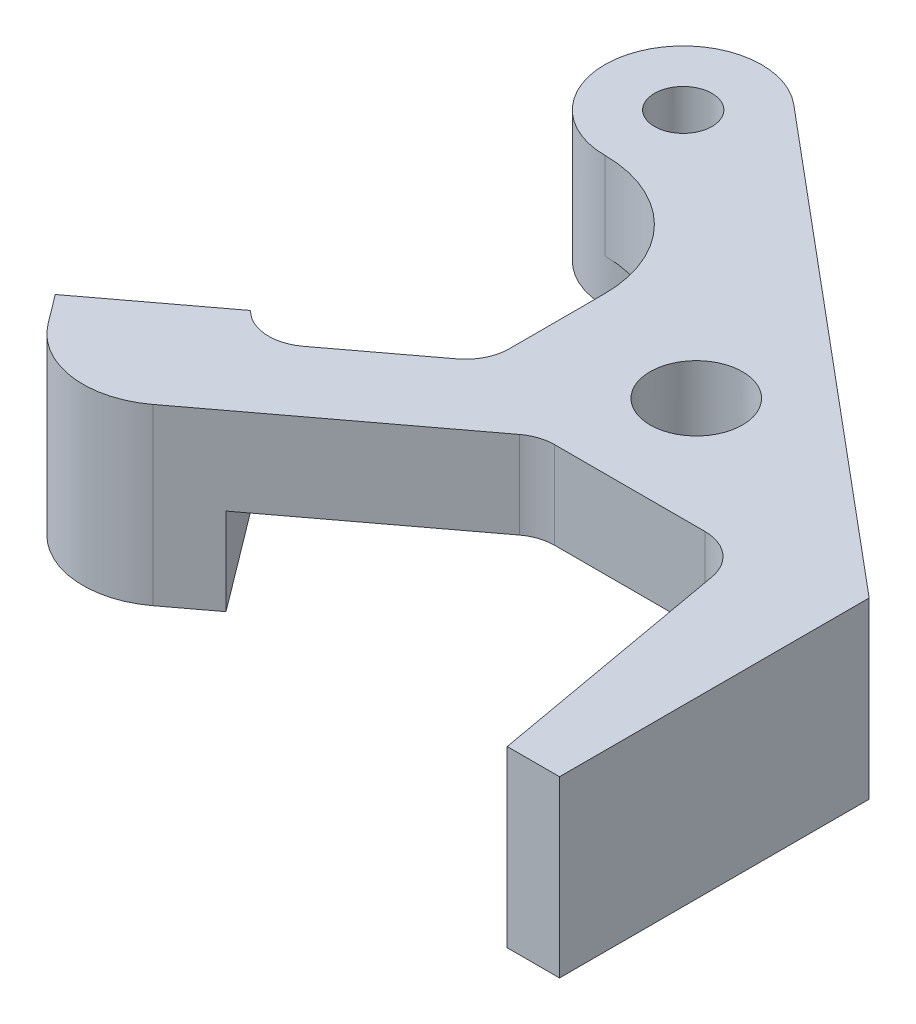
ISO-10303-21;
HEADER;
FILE_DESCRIPTION(('STEP AP214'),'2;1');
FILE_NAME('part.step','',(''),(''),'','','');
FILE_SCHEMA(('AUTOMOTIVE_DESIGN { 1 0 10303 214 1 1 1 1 }'));
ENDSEC;
DATA;
#1=APPLICATION_CONTEXT('core data for automotive mechanical design processes');
#2=APPLICATION_PROTOCOL_DEFINITION('international standard','automotive_design',2000,#1);
#3=PRODUCT_CONTEXT('',#1,'mechanical');
#4=PRODUCT('Part','Part','',(#3));
#5=PRODUCT_RELATED_PRODUCT_CATEGORY('part','',(#4));
#6=PRODUCT_DEFINITION_FORMATION('','',#4);
#7=PRODUCT_DEFINITION_CONTEXT('part definition',#1,'design');
#8=PRODUCT_DEFINITION('design','',#6,#7);
#9=PRODUCT_DEFINITION_SHAPE('','',#8);
#10=(LENGTH_UNIT() NAMED_UNIT(*) SI_UNIT(.MILLI.,.METRE.));
#11=(NAMED_UNIT(*) PLANE_ANGLE_UNIT() SI_UNIT($,.RADIAN.));
#12=(NAMED_UNIT(*) SI_UNIT($,.STERADIAN.) SOLID_ANGLE_UNIT());
#13=UNCERTAINTY_MEASURE_WITH_UNIT(LENGTH_MEASURE(1.E-05),#10,'distance_accuracy_value','');
#14=(GEOMETRIC_REPRESENTATION_CONTEXT(3) GLOBAL_UNCERTAINTY_ASSIGNED_CONTEXT((#13)) GLOBAL_UNIT_ASSIGNED_CONTEXT((#10,
#11,#12)) REPRESENTATION_CONTEXT('',''));
#15=CARTESIAN_POINT('',(0.,0.,0.));
#16=DIRECTION('',(0.,0.,1.));
#17=DIRECTION('',(1.,0.,0.));
#18=AXIS2_PLACEMENT_3D('',#15,#16,#17);
#19=CARTESIAN_POINT('',(29.5770247792777,15.,25.298132234084));
#20=DIRECTION('',(-1.,0.,0.));
#21=DIRECTION('',(0.,0.,1.));
#22=AXIS2_PLACEMENT_3D('',#19,#20,#21);
#23=PLANE('',#22);
#24=DIRECTION('',(0.,0.,1.));
#25=VECTOR('',#24,1.);
#26=CARTESIAN_POINT('',(29.5770247792777,5.,25.298132234084));
#27=LINE('',#26,#25);
#28=CARTESIAN_POINT('',(29.5770247792776,5.,7.53597274184177));
#29=VERTEX_POINT('',#28);
#30=CARTESIAN_POINT('',(29.5770247792777,5.,25.298132234084));
#31=VERTEX_POINT('',#30);
#32=EDGE_CURVE('E47',#29,#31,#27,.T.);
#33=ORIENTED_EDGE('',*,*,#32,.F.);
#34=DIRECTION('',(0.,-1.,0.));
#35=VECTOR('',#34,1.);
#36=CARTESIAN_POINT('',(29.5770247792776,15.,7.53597274184177));
#37=LINE('',#36,#35);
#38=CARTESIAN_POINT('',(29.5770247792776,15.,7.53597274184177));
#39=VERTEX_POINT('',#38);
#40=EDGE_CURVE('E40',#39,#29,#37,.T.);
#41=ORIENTED_EDGE('',*,*,#40,.F.);
#42=DIRECTION('',(0.,0.,-1.));
#43=VECTOR('',#42,1.);
#44=CARTESIAN_POINT('',(29.5770247792777,15.,25.298132234084));
#45=LINE('',#44,#43);
#46=CARTESIAN_POINT('',(29.5770247792777,15.,25.298132234084));
#47=VERTEX_POINT('',#46);
#48=EDGE_CURVE('E203',#47,#39,#45,.T.);
#49=ORIENTED_EDGE('',*,*,#48,.F.);
#50=DIRECTION('',(0.,-1.,0.));
#51=VECTOR('',#50,1.);
#52=CARTESIAN_POINT('',(29.5770247792777,15.,25.298132234084));
#53=LINE('',#52,#51);
#54=EDGE_CURVE('E238',#47,#31,#53,.T.);
#55=ORIENTED_EDGE('',*,*,#54,.T.);
#56=EDGE_LOOP('',(#33,#41,#49,#55));
#57=FACE_BOUND('',#56,.T.);
#58=ADVANCED_FACE('F33',(#57),#23,.F.);
#59=CARTESIAN_POINT('',(29.5770247792776,15.,7.53597274184177));
#60=DIRECTION('',(-0.642235166658426,0.,0.766507658609634));
#61=DIRECTION('',(0.766507658609634,0.,0.642235166658426));
#62=AXIS2_PLACEMENT_3D('',#59,#60,#61);
#63=PLANE('',#62);
#64=DIRECTION('',(0.766507658609634,0.,0.642235166658426));
#65=VECTOR('',#64,1.);
#66=CARTESIAN_POINT('',(29.5770247792776,5.,7.53597274184177));
#67=LINE('',#66,#65);
#68=CARTESIAN_POINT('',(22.3186698476297,5.,1.45440168794189));
#69=VERTEX_POINT('',#68);
#70=EDGE_CURVE('E297',#69,#29,#67,.T.);
#71=ORIENTED_EDGE('',*,*,#70,.F.);
#72=DIRECTION('',(0.,-1.,0.));
#73=VECTOR('',#72,1.);
#74=CARTESIAN_POINT('',(22.3186698476297,10.,1.45440168794189));
#75=LINE('',#74,#73);
#76=CARTESIAN_POINT('',(22.3186698476297,10.,1.45440168794189));
#77=VERTEX_POINT('',#76);
#78=EDGE_CURVE('E289',#77,#69,#75,.T.);
#79=ORIENTED_EDGE('',*,*,#78,.F.);
#80=DIRECTION('',(0.766507658609634,0.,0.642235166658426));
#81=VECTOR('',#80,1.);
#82=CARTESIAN_POINT('',(22.3186698476297,10.,1.45440168794189));
#83=LINE('',#82,#81);
#84=CARTESIAN_POINT('',(2.89005824996292,10.,-14.8242844637434));
#85=VERTEX_POINT('',#84);
#86=EDGE_CURVE('E306',#85,#77,#83,.T.);
#87=ORIENTED_EDGE('',*,*,#86,.F.);
#88=DIRECTION('',(0.,-1.,0.));
#89=VECTOR('',#88,1.);
#90=CARTESIAN_POINT('',(2.89005824996292,15.,-14.8242844637434));
#91=LINE('',#90,#89);
#92=CARTESIAN_POINT('',(2.89005824996292,15.,-14.8242844637434));
#93=VERTEX_POINT('',#92);
#94=EDGE_CURVE('E281',#93,#85,#91,.T.);
#95=ORIENTED_EDGE('',*,*,#94,.F.);
#96=DIRECTION('',(-0.766507658609634,0.,-0.642235166658426));
#97=VECTOR('',#96,1.);
#98=CARTESIAN_POINT('',(29.5770247792776,15.,7.53597274184177));
#99=LINE('',#98,#97);
#100=EDGE_CURVE('E206',#39,#93,#99,.T.);
#101=ORIENTED_EDGE('',*,*,#100,.F.);
#102=ORIENTED_EDGE('',*,*,#40,.T.);
#103=EDGE_LOOP('',(#71,#79,#87,#95,#101,#102));
#104=FACE_BOUND('',#103,.T.);
#105=ADVANCED_FACE('F354',(#104),#63,.F.);
#106=CARTESIAN_POINT('',(-2.44771868641612,15.,10.9979278536704));
#107=DIRECTION('',(0.600835617642508,0.,0.799372604341771));
#108=DIRECTION('',(0.799372604341771,0.,-0.600835617642508));
#109=AXIS2_PLACEMENT_3D('',#106,#107,#108);
#110=PLANE('',#109);
#111=CARTESIAN_POINT('',(-5.6452091037832,10.,13.4012703242404));
#112=DIRECTION('',(-0.600835617642508,0.,-0.799372604341771));
#113=DIRECTION('',(-0.799372604341771,0.,0.600835617642508));
#114=AXIS2_PLACEMENT_3D('',#111,#112,#113);
#115=CIRCLE('',#114,2.75);
#116=CARTESIAN_POINT('',(-7.84348376572307,10.,15.0535682727573));
#117=VERTEX_POINT('',#116);
#118=EDGE_CURVE('E420',#117,#117,#115,.T.);
#119=ORIENTED_EDGE('',*,*,#118,.F.);
#120=EDGE_LOOP('',(#119));
#121=FACE_BOUND('',#120,.T.);
#122=DIRECTION('',(0.799372604341771,0.,-0.600835617642508));
#123=VECTOR('',#122,1.);
#124=CARTESIAN_POINT('',(-2.44771868641612,5.,10.9979278536704));
#125=LINE('',#124,#123);
#126=CARTESIAN_POINT('',(-8.84269952115029,5.,15.8046127948105));
#127=VERTEX_POINT('',#126);
#128=CARTESIAN_POINT('',(-2.44771868641612,5.,10.9979278536704));
#129=VERTEX_POINT('',#128);
#130=EDGE_CURVE('E54',#127,#129,#125,.T.);
#131=ORIENTED_EDGE('',*,*,#130,.F.);
#132=DIRECTION('',(0.,-1.,0.));
#133=VECTOR('',#132,1.);
#134=CARTESIAN_POINT('',(-8.84269952115029,15.,15.8046127948105));
#135=LINE('',#134,#133);
#136=CARTESIAN_POINT('',(-8.84269952115029,15.,15.8046127948105));
#137=VERTEX_POINT('',#136);
#138=EDGE_CURVE('E260',#137,#127,#135,.T.);
#139=ORIENTED_EDGE('',*,*,#138,.F.);
#140=DIRECTION('',(-0.799372604341771,0.,0.600835617642508));
#141=VECTOR('',#140,1.);
#142=CARTESIAN_POINT('',(-2.44771868641612,15.,10.9979278536704));
#143=LINE('',#142,#141);
#144=CARTESIAN_POINT('',(-2.44771868641611,15.,10.9979278536704));
#145=VERTEX_POINT('',#144);
#146=EDGE_CURVE('E220',#145,#137,#143,.T.);
#147=ORIENTED_EDGE('',*,*,#146,.F.);
#148=DIRECTION('',(0.,-1.,0.));
#149=VECTOR('',#148,1.);
#150=CARTESIAN_POINT('',(-2.44771868641611,15.,10.9979278536704));
#151=LINE('',#150,#149);
#152=CARTESIAN_POINT('',(-2.44771868641612,10.,10.9979278536704));
#153=VERTEX_POINT('',#152);
#154=EDGE_CURVE('E263',#145,#153,#151,.T.);
#155=ORIENTED_EDGE('',*,*,#154,.T.);
#156=DIRECTION('',(0.,-1.,0.));
#157=VECTOR('',#156,1.);
#158=CARTESIAN_POINT('',(-2.44771868641612,10.,10.9979278536704));
#159=LINE('',#158,#157);
#160=EDGE_CURVE('E310',#153,#129,#159,.T.);
#161=ORIENTED_EDGE('',*,*,#160,.T.);
#162=EDGE_LOOP('',(#131,#139,#147,#155,#161));
#163=FACE_BOUND('',#162,.T.);
#164=ADVANCED_FACE('F385',(#121,#163),#110,.F.);
#165=CARTESIAN_POINT('',(-8.84269952115029,15.,15.8046127948105));
#166=DIRECTION('',(0.799372604341771,0.,-0.600835617642508));
#167=DIRECTION('',(-0.600835617642508,0.,-0.799372604341771));
#168=AXIS2_PLACEMENT_3D('',#165,#166,#167);
#169=PLANE('',#168);
#170=DIRECTION('',(-0.600835617642508,0.,-0.799372604341771));
#171=VECTOR('',#170,1.);
#172=CARTESIAN_POINT('',(-8.84269952115029,5.,15.8046127948105));
#173=LINE('',#172,#171);
#174=CARTESIAN_POINT('',(-7.58603056717289,5.,17.4765288814065));
#175=VERTEX_POINT('',#174);
#176=EDGE_CURVE('E415',#175,#127,#173,.T.);
#177=ORIENTED_EDGE('',*,*,#176,.F.);
#178=DIRECTION('',(0.,-1.,0.));
#179=VECTOR('',#178,1.);
#180=CARTESIAN_POINT('',(-7.58603056717289,15.,17.4765288814065));
#181=LINE('',#180,#179);
#182=CARTESIAN_POINT('',(-7.58603056717289,15.,17.4765288814065));
#183=VERTEX_POINT('',#182);
#184=EDGE_CURVE('E257',#183,#175,#181,.T.);
#185=ORIENTED_EDGE('',*,*,#184,.F.);
#186=DIRECTION('',(0.600835617642508,0.,0.799372604341771));
#187=VECTOR('',#186,1.);
#188=CARTESIAN_POINT('',(-8.84269952115029,15.,15.8046127948105));
#189=LINE('',#188,#187);
#190=EDGE_CURVE('E222',#137,#183,#189,.T.);
#191=ORIENTED_EDGE('',*,*,#190,.F.);
#192=ORIENTED_EDGE('',*,*,#138,.T.);
#193=EDGE_LOOP('',(#177,#185,#191,#192));
#194=FACE_BOUND('',#193,.T.);
#195=ADVANCED_FACE('F436',(#194),#169,.F.);
#196=CARTESIAN_POINT('',(-3.58916754546404,15.,14.472350793194));
#197=DIRECTION('',(0.,-1.,0.));
#198=DIRECTION('',(0.,0.,-1.));
#199=AXIS2_PLACEMENT_3D('',#196,#197,#198);
#200=CYLINDRICAL_SURFACE('',#199,5.);
#201=CARTESIAN_POINT('',(-3.58916754546404,5.,14.472350793194));
#202=DIRECTION('',(0.,-1.,0.));
#203=DIRECTION('',(0.,0.,-1.));
#204=AXIS2_PLACEMENT_3D('',#201,#202,#203);
#205=CIRCLE('',#204,5.);
#206=CARTESIAN_POINT('',(-0.584989457251495,5.,18.4692138149028));
#207=VERTEX_POINT('',#206);
#208=EDGE_CURVE('E179',#207,#175,#205,.T.);
#209=ORIENTED_EDGE('',*,*,#208,.F.);
#210=DIRECTION('',(0.,-1.,0.));
#211=VECTOR('',#210,1.);
#212=CARTESIAN_POINT('',(-0.584989457251495,15.,18.4692138149028));
#213=LINE('',#212,#211);
#214=CARTESIAN_POINT('',(-0.584989457251495,15.,18.4692138149028));
#215=VERTEX_POINT('',#214);
#216=EDGE_CURVE('E178',#215,#207,#213,.T.);
#217=ORIENTED_EDGE('',*,*,#216,.F.);
#218=CARTESIAN_POINT('',(-3.58916754546404,15.,14.472350793194));
#219=DIRECTION('',(0.,1.,0.));
#220=DIRECTION('',(0.,0.,1.));
#221=AXIS2_PLACEMENT_3D('',#218,#219,#220);
#222=CIRCLE('',#221,5.);
#223=EDGE_CURVE('E224',#183,#215,#222,.T.);
#224=ORIENTED_EDGE('',*,*,#223,.F.);
#225=ORIENTED_EDGE('',*,*,#184,.T.);
#226=EDGE_LOOP('',(#209,#217,#224,#225));
#227=FACE_BOUND('',#226,.T.);
#228=ADVANCED_FACE('F441',(#227),#200,.T.);
#229=CARTESIAN_POINT('',(-0.584989457251495,15.,18.4692138149028));
#230=DIRECTION('',(-0.600835617642508,0.,-0.799372604341771));
#231=DIRECTION('',(-0.799372604341771,0.,0.600835617642508));
#232=AXIS2_PLACEMENT_3D('',#229,#230,#231);
#233=PLANE('',#232);
#234=DIRECTION('',(-0.799372604341771,0.,0.600835617642508));
#235=VECTOR('',#234,1.);
#236=CARTESIAN_POINT('',(-0.584989457251495,5.,18.4692138149028));
#237=LINE('',#236,#235);
#238=CARTESIAN_POINT('',(1.81312835577382,5.,16.6667069619753));
#239=VERTEX_POINT('',#238);
#240=EDGE_CURVE('E164',#239,#207,#237,.T.);
#241=ORIENTED_EDGE('',*,*,#240,.F.);
#242=DIRECTION('',(0.,1.,0.));
#243=VECTOR('',#242,1.);
#244=CARTESIAN_POINT('',(1.81312835577382,15.,16.6667069619753));
#245=LINE('',#244,#243);
#246=CARTESIAN_POINT('',(1.81312835577382,10.,16.6667069619753));
#247=VERTEX_POINT('',#246);
#248=EDGE_CURVE('E174',#239,#247,#245,.T.);
#249=ORIENTED_EDGE('',*,*,#248,.T.);
#250=DIRECTION('',(-0.799372604341771,0.,0.600835617642508));
#251=VECTOR('',#250,1.);
#252=CARTESIAN_POINT('',(-0.584989457251495,10.,18.4692138149028));
#253=LINE('',#252,#251);
#254=CARTESIAN_POINT('',(11.4228518339597,10.,9.44371219078979));
#255=VERTEX_POINT('',#254);
#256=EDGE_CURVE('E319',#255,#247,#253,.T.);
#257=ORIENTED_EDGE('',*,*,#256,.F.);
#258=DIRECTION('',(0.,-1.,0.));
#259=VECTOR('',#258,1.);
#260=CARTESIAN_POINT('',(11.4228518339597,15.,9.44371219078979));
#261=LINE('',#260,#259);
#262=CARTESIAN_POINT('',(11.4228518339597,15.,9.44371219078979));
#263=VERTEX_POINT('',#262);
#264=EDGE_CURVE('E253',#263,#255,#261,.T.);
#265=ORIENTED_EDGE('',*,*,#264,.F.);
#266=DIRECTION('',(0.799372604341771,0.,-0.600835617642508));
#267=VECTOR('',#266,1.);
#268=CARTESIAN_POINT('',(-0.584989457251495,15.,18.4692138149028));
#269=LINE('',#268,#267);
#270=EDGE_CURVE('E226',#215,#263,#269,.T.);
#271=ORIENTED_EDGE('',*,*,#270,.F.);
#272=ORIENTED_EDGE('',*,*,#216,.T.);
#273=EDGE_LOOP('',(#241,#249,#257,#265,#271,#272));
#274=FACE_BOUND('',#273,.T.);
#275=ADVANCED_FACE('F172',(#274),#233,.F.);
#276=CARTESIAN_POINT('',(24.0239261003502,15.,11.0026125004812));
#277=DIRECTION('',(0.984423674904598,0.,-0.175812480465197));
#278=DIRECTION('',(-0.175812480465197,0.,-0.984423674904599));
#279=AXIS2_PLACEMENT_3D('',#276,#277,#278);
#280=PLANE('',#279);
#281=DIRECTION('',(-0.175812480465197,0.,-0.984423674904599));
#282=VECTOR('',#281,1.);
#283=CARTESIAN_POINT('',(24.0239261003502,5.,11.0026125004812));
#284=LINE('',#283,#282);
#285=CARTESIAN_POINT('',(26.5770247792777,5.,25.298132234084));
#286=VERTEX_POINT('',#285);
#287=EDGE_CURVE('E299',#286,#69,#284,.T.);
#288=ORIENTED_EDGE('',*,*,#287,.F.);
#289=DIRECTION('',(0.,-1.,0.));
#290=VECTOR('',#289,1.);
#291=CARTESIAN_POINT('',(26.5770247792777,15.,25.298132234084));
#292=LINE('',#291,#290);
#293=CARTESIAN_POINT('',(26.5770247792777,15.,25.298132234084));
#294=VERTEX_POINT('',#293);
#295=EDGE_CURVE('E241',#294,#286,#292,.T.);
#296=ORIENTED_EDGE('',*,*,#295,.F.);
#297=DIRECTION('',(0.175812480465197,0.,0.984423674904599));
#298=VECTOR('',#297,1.);
#299=CARTESIAN_POINT('',(24.0239261003502,15.,11.0026125004812));
#300=LINE('',#299,#298);
#301=CARTESIAN_POINT('',(24.0239261003502,15.,11.0026125004812));
#302=VERTEX_POINT('',#301);
#303=EDGE_CURVE('E234',#302,#294,#300,.T.);
#304=ORIENTED_EDGE('',*,*,#303,.F.);
#305=DIRECTION('',(0.,-1.,0.));
#306=VECTOR('',#305,1.);
#307=CARTESIAN_POINT('',(24.0239261003502,15.,11.0026125004812));
#308=LINE('',#307,#306);
#309=CARTESIAN_POINT('',(24.0239261003502,10.,11.0026125004812));
#310=VERTEX_POINT('',#309);
#311=EDGE_CURVE('E244',#302,#310,#308,.T.);
#312=ORIENTED_EDGE('',*,*,#311,.T.);
#313=DIRECTION('',(0.175812480465197,0.,0.984423674904599));
#314=VECTOR('',#313,1.);
#315=CARTESIAN_POINT('',(24.0239261003502,10.,11.0026125004812));
#316=LINE('',#315,#314);
#317=EDGE_CURVE('E308',#77,#310,#316,.T.);
#318=ORIENTED_EDGE('',*,*,#317,.F.);
#319=ORIENTED_EDGE('',*,*,#78,.T.);
#320=EDGE_LOOP('',(#288,#296,#304,#312,#318,#319));
#321=FACE_BOUND('',#320,.T.);
#322=ADVANCED_FACE('F357',(#321),#280,.F.);
#323=CARTESIAN_POINT('',(26.5770247792777,15.,25.298132234084));
#324=DIRECTION('',(0.,0.,-1.));
#325=DIRECTION('',(-1.,0.,0.));
#326=AXIS2_PLACEMENT_3D('',#323,#324,#325);
#327=PLANE('',#326);
#328=DIRECTION('',(-1.,0.,0.));
#329=VECTOR('',#328,1.);
#330=CARTESIAN_POINT('',(26.5770247792777,5.,25.298132234084));
#331=LINE('',#330,#329);
#332=EDGE_CURVE('E413',#31,#286,#331,.T.);
#333=ORIENTED_EDGE('',*,*,#332,.F.);
#334=ORIENTED_EDGE('',*,*,#54,.F.);
#335=DIRECTION('',(1.,0.,0.));
#336=VECTOR('',#335,1.);
#337=CARTESIAN_POINT('',(26.5770247792777,15.,25.298132234084));
#338=LINE('',#337,#336);
#339=EDGE_CURVE('E236',#294,#47,#338,.T.);
#340=ORIENTED_EDGE('',*,*,#339,.F.);
#341=ORIENTED_EDGE('',*,*,#295,.T.);
#342=EDGE_LOOP('',(#333,#334,#340,#341));
#343=FACE_BOUND('',#342,.T.);
#344=ADVANCED_FACE('F412',(#343),#327,.F.);
#345=CARTESIAN_POINT('',(-2.44771868641612,10.,10.9979278536704));
#346=DIRECTION('',(-0.799372604341771,0.,0.600835617642508));
#347=DIRECTION('',(0.600835617642508,0.,0.799372604341771));
#348=AXIS2_PLACEMENT_3D('',#345,#346,#347);
#349=PLANE('',#348);
#350=DIRECTION('',(0.600835617642508,0.,0.799372604341771));
#351=VECTOR('',#350,1.);
#352=CARTESIAN_POINT('',(-2.44771868641612,5.,10.9979278536704));
#353=LINE('',#352,#351);
#354=EDGE_CURVE('E11',#129,#239,#353,.T.);
#355=ORIENTED_EDGE('',*,*,#354,.F.);
#356=ORIENTED_EDGE('',*,*,#160,.F.);
#357=DIRECTION('',(-0.600835617642508,0.,-0.799372604341771));
#358=VECTOR('',#357,1.);
#359=CARTESIAN_POINT('',(-2.44771868641612,10.,10.9979278536704));
#360=LINE('',#359,#358);
#361=EDGE_CURVE('E184',#247,#153,#360,.T.);
#362=ORIENTED_EDGE('',*,*,#361,.F.);
#363=ORIENTED_EDGE('',*,*,#248,.F.);
#364=EDGE_LOOP('',(#355,#356,#362,#363));
#365=FACE_BOUND('',#364,.T.);
#366=ADVANCED_FACE('F183',(#365),#349,.F.);
#367=CARTESIAN_POINT('',(0.,15.,-11.375));
#368=DIRECTION('',(0.,1.,0.));
#369=DIRECTION('',(0.,0.,1.));
#370=AXIS2_PLACEMENT_3D('',#367,#368,#369);
#371=CYLINDRICAL_SURFACE('',#370,1.65);
#372=CARTESIAN_POINT('',(0.,15.,-11.375));
#373=DIRECTION('',(0.,1.,0.));
#374=DIRECTION('',(0.,0.,1.));
#375=AXIS2_PLACEMENT_3D('',#372,#373,#374);
#376=CIRCLE('',#375,1.65);
#377=CARTESIAN_POINT('',(0.,15.,-9.725));
#378=VERTEX_POINT('',#377);
#379=EDGE_CURVE('E197',#378,#378,#376,.T.);
#380=ORIENTED_EDGE('',*,*,#379,.T.);
#381=EDGE_LOOP('',(#380));
#382=FACE_BOUND('',#381,.T.);
#383=CARTESIAN_POINT('',(0.,2.5,-11.375));
#384=DIRECTION('',(0.,-1.,0.));
#385=DIRECTION('',(0.,0.,-1.));
#386=AXIS2_PLACEMENT_3D('',#383,#384,#385);
#387=CIRCLE('',#386,1.65);
#388=CARTESIAN_POINT('',(0.,2.5,-13.025));
#389=VERTEX_POINT('',#388);
#390=EDGE_CURVE('E292',#389,#389,#387,.F.);
#391=ORIENTED_EDGE('',*,*,#390,.F.);
#392=EDGE_LOOP('',(#391));
#393=FACE_BOUND('',#392,.T.);
#394=ADVANCED_FACE('F488',(#382,#393),#371,.F.);
#395=CARTESIAN_POINT('',(0.,7.5,-11.375));
#396=DIRECTION('',(0.,-1.,0.));
#397=DIRECTION('',(0.,0.,-1.));
#398=AXIS2_PLACEMENT_3D('',#395,#396,#397);
#399=CYLINDRICAL_SURFACE('',#398,3.15);
#400=CARTESIAN_POINT('',(0.,7.5,-11.375));
#401=DIRECTION('',(0.,-1.,0.));
#402=DIRECTION('',(0.,0.,-1.));
#403=AXIS2_PLACEMENT_3D('',#400,#401,#402);
#404=CIRCLE('',#403,3.15);
#405=CARTESIAN_POINT('',(0.,7.5,-14.525));
#406=VERTEX_POINT('',#405);
#407=EDGE_CURVE('E185',#406,#406,#404,.T.);
#408=ORIENTED_EDGE('',*,*,#407,.T.);
#409=EDGE_LOOP('',(#408));
#410=FACE_BOUND('',#409,.T.);
#411=CARTESIAN_POINT('',(0.,2.5,-11.375));
#412=DIRECTION('',(0.,-1.,0.));
#413=DIRECTION('',(0.,0.,-1.));
#414=AXIS2_PLACEMENT_3D('',#411,#412,#413);
#415=CIRCLE('',#414,3.15);
#416=CARTESIAN_POINT('',(0.,2.5,-14.525));
#417=VERTEX_POINT('',#416);
#418=EDGE_CURVE('E290',#417,#417,#415,.F.);
#419=ORIENTED_EDGE('',*,*,#418,.T.);
#420=EDGE_LOOP('',(#419));
#421=FACE_BOUND('',#420,.T.);
#422=ADVANCED_FACE('F496',(#410,#421),#399,.T.);
#423=CARTESIAN_POINT('',(0.,15.,0.));
#424=DIRECTION('',(0.,-1.,0.));
#425=DIRECTION('',(0.,0.,-1.));
#426=AXIS2_PLACEMENT_3D('',#423,#424,#425);
#427=CYLINDRICAL_SURFACE('',#426,6.875);
#428=CARTESIAN_POINT('',(0.,10.,0.));
#429=DIRECTION('',(0.,-1.,0.));
#430=DIRECTION('',(0.,0.,-1.));
#431=AXIS2_PLACEMENT_3D('',#428,#429,#430);
#432=CIRCLE('',#431,6.875);
#433=CARTESIAN_POINT('',(6.875,10.,0.));
#434=VERTEX_POINT('',#433);
#435=CARTESIAN_POINT('',(0.,10.,-6.875));
#436=VERTEX_POINT('',#435);
#437=EDGE_CURVE('E186',#434,#436,#432,.F.);
#438=ORIENTED_EDGE('',*,*,#437,.F.);
#439=DIRECTION('',(0.,-1.,0.));
#440=VECTOR('',#439,1.);
#441=CARTESIAN_POINT('',(6.875,15.,0.));
#442=LINE('',#441,#440);
#443=CARTESIAN_POINT('',(6.875,15.,0.));
#444=VERTEX_POINT('',#443);
#445=EDGE_CURVE('E275',#444,#434,#442,.T.);
#446=ORIENTED_EDGE('',*,*,#445,.F.);
#447=CARTESIAN_POINT('',(0.,15.,0.));
#448=DIRECTION('',(0.,-1.,0.));
#449=DIRECTION('',(0.,0.,-1.));
#450=AXIS2_PLACEMENT_3D('',#447,#448,#449);
#451=CIRCLE('',#450,6.875);
#452=CARTESIAN_POINT('',(0.,15.,-6.875));
#453=VERTEX_POINT('',#452);
#454=EDGE_CURVE('E210',#453,#444,#451,.T.);
#455=ORIENTED_EDGE('',*,*,#454,.F.);
#456=DIRECTION('',(0.,-1.,0.));
#457=VECTOR('',#456,1.);
#458=CARTESIAN_POINT('',(0.,15.,-6.875));
#459=LINE('',#458,#457);
#460=EDGE_CURVE('E278',#453,#436,#459,.T.);
#461=ORIENTED_EDGE('',*,*,#460,.T.);
#462=EDGE_LOOP('',(#438,#446,#455,#461));
#463=FACE_BOUND('',#462,.T.);
#464=ADVANCED_FACE('F336',(#463),#427,.F.);
#465=CARTESIAN_POINT('',(6.875,15.,0.));
#466=DIRECTION('',(1.,0.,0.));
#467=DIRECTION('',(0.,0.,-1.));
#468=AXIS2_PLACEMENT_3D('',#465,#466,#467);
#469=PLANE('',#468);
#470=DIRECTION('',(0.,0.,-1.));
#471=VECTOR('',#470,1.);
#472=CARTESIAN_POINT('',(6.875,10.,0.));
#473=LINE('',#472,#471);
#474=CARTESIAN_POINT('',(6.875,10.,5.48279869002336));
#475=VERTEX_POINT('',#474);
#476=EDGE_CURVE('E191',#475,#434,#473,.T.);
#477=ORIENTED_EDGE('',*,*,#476,.F.);
#478=DIRECTION('',(0.,-1.,0.));
#479=VECTOR('',#478,1.);
#480=CARTESIAN_POINT('',(6.875,15.,5.48279869002336));
#481=LINE('',#480,#479);
#482=CARTESIAN_POINT('',(6.875,15.,5.48279869002336));
#483=VERTEX_POINT('',#482);
#484=EDGE_CURVE('E272',#483,#475,#481,.T.);
#485=ORIENTED_EDGE('',*,*,#484,.F.);
#486=DIRECTION('',(0.,0.,1.));
#487=VECTOR('',#486,1.);
#488=CARTESIAN_POINT('',(6.875,15.,0.));
#489=LINE('',#488,#487);
#490=EDGE_CURVE('E212',#444,#483,#489,.T.);
#491=ORIENTED_EDGE('',*,*,#490,.F.);
#492=ORIENTED_EDGE('',*,*,#445,.T.);
#493=EDGE_LOOP('',(#477,#485,#491,#492));
#494=FACE_BOUND('',#493,.T.);
#495=ADVANCED_FACE('F340',(#494),#469,.F.);
#496=CARTESIAN_POINT('',(4.375,15.,5.48279869002336));
#497=DIRECTION('',(0.,-1.,0.));
#498=DIRECTION('',(0.,0.,-1.));
#499=AXIS2_PLACEMENT_3D('',#496,#497,#498);
#500=CYLINDRICAL_SURFACE('',#499,2.5);
#501=CARTESIAN_POINT('',(4.375,10.,5.48279869002336));
#502=DIRECTION('',(0.,-1.,0.));
#503=DIRECTION('',(0.,0.,-1.));
#504=AXIS2_PLACEMENT_3D('',#501,#502,#503);
#505=CIRCLE('',#504,2.5);
#506=CARTESIAN_POINT('',(5.87708904410627,10.,7.48123020087779));
#507=VERTEX_POINT('',#506);
#508=EDGE_CURVE('E325',#507,#475,#505,.F.);
#509=ORIENTED_EDGE('',*,*,#508,.F.);
#510=DIRECTION('',(0.,-1.,0.));
#511=VECTOR('',#510,1.);
#512=CARTESIAN_POINT('',(5.87708904410627,15.,7.48123020087779));
#513=LINE('',#512,#511);
#514=CARTESIAN_POINT('',(5.87708904410627,15.,7.48123020087779));
#515=VERTEX_POINT('',#514);
#516=EDGE_CURVE('E269',#515,#507,#513,.T.);
#517=ORIENTED_EDGE('',*,*,#516,.F.);
#518=CARTESIAN_POINT('',(4.375,15.,5.48279869002336));
#519=DIRECTION('',(0.,-1.,0.));
#520=DIRECTION('',(0.,0.,-1.));
#521=AXIS2_PLACEMENT_3D('',#518,#519,#520);
#522=CIRCLE('',#521,2.5);
#523=EDGE_CURVE('E214',#483,#515,#522,.T.);
#524=ORIENTED_EDGE('',*,*,#523,.F.);
#525=ORIENTED_EDGE('',*,*,#484,.T.);
#526=EDGE_LOOP('',(#509,#517,#524,#525));
#527=FACE_BOUND('',#526,.T.);
#528=ADVANCED_FACE('F393',(#527),#500,.F.);
#529=CARTESIAN_POINT('',(5.87708904410627,15.,7.48123020087779));
#530=DIRECTION('',(0.600835617642508,0.,0.799372604341771));
#531=DIRECTION('',(0.799372604341771,0.,-0.600835617642508));
#532=AXIS2_PLACEMENT_3D('',#529,#530,#531);
#533=PLANE('',#532);
#534=DIRECTION('',(0.799372604341771,0.,-0.600835617642508));
#535=VECTOR('',#534,1.);
#536=CARTESIAN_POINT('',(5.87708904410627,10.,7.48123020087779));
#537=LINE('',#536,#535);
#538=CARTESIAN_POINT('',(0.851602255927196,10.,11.2585568717313));
#539=VERTEX_POINT('',#538);
#540=EDGE_CURVE('E323',#539,#507,#537,.T.);
#541=ORIENTED_EDGE('',*,*,#540,.F.);
#542=DIRECTION('',(0.,-1.,0.));
#543=VECTOR('',#542,1.);
#544=CARTESIAN_POINT('',(0.851602255927196,15.,11.2585568717313));
#545=LINE('',#544,#543);
#546=CARTESIAN_POINT('',(0.851602255927196,15.,11.2585568717313));
#547=VERTEX_POINT('',#546);
#548=EDGE_CURVE('E266',#547,#539,#545,.T.);
#549=ORIENTED_EDGE('',*,*,#548,.F.);
#550=DIRECTION('',(-0.799372604341771,0.,0.600835617642508));
#551=VECTOR('',#550,1.);
#552=CARTESIAN_POINT('',(5.87708904410627,15.,7.48123020087779));
#553=LINE('',#552,#551);
#554=EDGE_CURVE('E216',#515,#547,#553,.T.);
#555=ORIENTED_EDGE('',*,*,#554,.F.);
#556=ORIENTED_EDGE('',*,*,#516,.T.);
#557=EDGE_LOOP('',(#541,#549,#555,#556));
#558=FACE_BOUND('',#557,.T.);
#559=ADVANCED_FACE('F391',(#558),#533,.F.);
#560=CARTESIAN_POINT('',(-0.650486788179074,15.,9.26012536087692));
#561=DIRECTION('',(0.,-1.,0.));
#562=DIRECTION('',(0.,0.,-1.));
#563=AXIS2_PLACEMENT_3D('',#560,#561,#562);
#564=CYLINDRICAL_SURFACE('',#563,2.5);
#565=CARTESIAN_POINT('',(-0.650486788179074,10.,9.26012536087692));
#566=DIRECTION('',(0.,-1.,0.));
#567=DIRECTION('',(0.,0.,-1.));
#568=AXIS2_PLACEMENT_3D('',#565,#566,#567);
#569=CIRCLE('',#568,2.5);
#570=EDGE_CURVE('E321',#153,#539,#569,.F.);
#571=ORIENTED_EDGE('',*,*,#570,.F.);
#572=ORIENTED_EDGE('',*,*,#154,.F.);
#573=CARTESIAN_POINT('',(-0.650486788179074,15.,9.26012536087692));
#574=DIRECTION('',(0.,-1.,0.));
#575=DIRECTION('',(0.,0.,-1.));
#576=AXIS2_PLACEMENT_3D('',#573,#574,#575);
#577=CIRCLE('',#576,2.5);
#578=EDGE_CURVE('E218',#547,#145,#577,.T.);
#579=ORIENTED_EDGE('',*,*,#578,.F.);
#580=ORIENTED_EDGE('',*,*,#548,.T.);
#581=EDGE_LOOP('',(#571,#572,#579,#580));
#582=FACE_BOUND('',#581,.T.);
#583=ADVANCED_FACE('F381',(#582),#564,.F.);
#584=CARTESIAN_POINT('',(12.924940878066,15.,11.4421437016442));
#585=DIRECTION('',(0.,-1.,0.));
#586=DIRECTION('',(0.,0.,-1.));
#587=AXIS2_PLACEMENT_3D('',#584,#585,#586);
#588=CYLINDRICAL_SURFACE('',#587,2.50000000000002);
#589=CARTESIAN_POINT('',(12.924940878066,10.,11.4421437016442));
#590=DIRECTION('',(0.,-1.,0.));
#591=DIRECTION('',(0.,0.,-1.));
#592=AXIS2_PLACEMENT_3D('',#589,#590,#591);
#593=CIRCLE('',#592,2.50000000000002);
#594=CARTESIAN_POINT('',(12.924940878066,10.,8.94214370164422));
#595=VERTEX_POINT('',#594);
#596=EDGE_CURVE('E317',#595,#255,#593,.F.);
#597=ORIENTED_EDGE('',*,*,#596,.F.);
#598=DIRECTION('',(0.,-1.,0.));
#599=VECTOR('',#598,1.);
#600=CARTESIAN_POINT('',(12.924940878066,15.,8.94214370164422));
#601=LINE('',#600,#599);
#602=CARTESIAN_POINT('',(12.924940878066,15.,8.94214370164422));
#603=VERTEX_POINT('',#602);
#604=EDGE_CURVE('E250',#603,#595,#601,.T.);
#605=ORIENTED_EDGE('',*,*,#604,.F.);
#606=CARTESIAN_POINT('',(12.924940878066,15.,11.4421437016442));
#607=DIRECTION('',(0.,-1.,0.));
#608=DIRECTION('',(0.,0.,-1.));
#609=AXIS2_PLACEMENT_3D('',#606,#607,#608);
#610=CIRCLE('',#609,2.50000000000002);
#611=EDGE_CURVE('E228',#263,#603,#610,.T.);
#612=ORIENTED_EDGE('',*,*,#611,.F.);
#613=ORIENTED_EDGE('',*,*,#264,.T.);
#614=EDGE_LOOP('',(#597,#605,#612,#613));
#615=FACE_BOUND('',#614,.T.);
#616=ADVANCED_FACE('F373',(#615),#588,.F.);
#617=CARTESIAN_POINT('',(12.924940878066,15.,8.94214370164422));
#618=DIRECTION('',(0.,0.,-1.));
#619=DIRECTION('',(-1.,0.,0.));
#620=AXIS2_PLACEMENT_3D('',#617,#618,#619);
#621=PLANE('',#620);
#622=DIRECTION('',(-1.,0.,0.));
#623=VECTOR('',#622,1.);
#624=CARTESIAN_POINT('',(12.924940878066,10.,8.94214370164422));
#625=LINE('',#624,#623);
#626=CARTESIAN_POINT('',(21.5628669130887,10.,8.94214370164422));
#627=VERTEX_POINT('',#626);
#628=EDGE_CURVE('E315',#627,#595,#625,.T.);
#629=ORIENTED_EDGE('',*,*,#628,.F.);
#630=DIRECTION('',(0.,-1.,0.));
#631=VECTOR('',#630,1.);
#632=CARTESIAN_POINT('',(21.5628669130887,15.,8.94214370164422));
#633=LINE('',#632,#631);
#634=CARTESIAN_POINT('',(21.5628669130887,15.,8.94214370164422));
#635=VERTEX_POINT('',#634);
#636=EDGE_CURVE('E247',#635,#627,#633,.T.);
#637=ORIENTED_EDGE('',*,*,#636,.F.);
#638=DIRECTION('',(1.,0.,0.));
#639=VECTOR('',#638,1.);
#640=CARTESIAN_POINT('',(12.924940878066,15.,8.94214370164422));
#641=LINE('',#640,#639);
#642=EDGE_CURVE('E230',#603,#635,#641,.T.);
#643=ORIENTED_EDGE('',*,*,#642,.F.);
#644=ORIENTED_EDGE('',*,*,#604,.T.);
#645=EDGE_LOOP('',(#629,#637,#643,#644));
#646=FACE_BOUND('',#645,.T.);
#647=ADVANCED_FACE('F369',(#646),#621,.F.);
#648=CARTESIAN_POINT('',(21.5628669130887,15.,11.4421437016442));
#649=DIRECTION('',(0.,-1.,0.));
#650=DIRECTION('',(0.,0.,-1.));
#651=AXIS2_PLACEMENT_3D('',#648,#649,#650);
#652=CYLINDRICAL_SURFACE('',#651,2.5);
#653=CARTESIAN_POINT('',(21.5628669130887,10.,11.4421437016442));
#654=DIRECTION('',(0.,-1.,0.));
#655=DIRECTION('',(0.,0.,-1.));
#656=AXIS2_PLACEMENT_3D('',#653,#654,#655);
#657=CIRCLE('',#656,2.5);
#658=EDGE_CURVE('E288',#310,#627,#657,.F.);
#659=ORIENTED_EDGE('',*,*,#658,.F.);
#660=ORIENTED_EDGE('',*,*,#311,.F.);
#661=CARTESIAN_POINT('',(21.5628669130887,15.,11.4421437016442));
#662=DIRECTION('',(0.,-1.,0.));
#663=DIRECTION('',(0.,0.,-1.));
#664=AXIS2_PLACEMENT_3D('',#661,#662,#663);
#665=CIRCLE('',#664,2.5);
#666=EDGE_CURVE('E232',#635,#302,#665,.T.);
#667=ORIENTED_EDGE('',*,*,#666,.F.);
#668=ORIENTED_EDGE('',*,*,#636,.T.);
#669=EDGE_LOOP('',(#659,#660,#667,#668));
#670=FACE_BOUND('',#669,.T.);
#671=ADVANCED_FACE('F364',(#670),#652,.F.);
#672=CARTESIAN_POINT('',(14.7012162045247,15.,2.57736988359072));
#673=DIRECTION('',(0.,1.,0.));
#674=DIRECTION('',(0.,0.,1.));
#675=AXIS2_PLACEMENT_3D('',#672,#673,#674);
#676=CYLINDRICAL_SURFACE('',#675,2.64999999999999);
#677=CARTESIAN_POINT('',(14.7012162045247,15.,2.57736988359072));
#678=DIRECTION('',(0.,1.,0.));
#679=DIRECTION('',(0.,0.,1.));
#680=AXIS2_PLACEMENT_3D('',#677,#678,#679);
#681=CIRCLE('',#680,2.64999999999999);
#682=CARTESIAN_POINT('',(14.7012162045247,15.,5.22736988359071));
#683=VERTEX_POINT('',#682);
#684=EDGE_CURVE('E200',#683,#683,#681,.T.);
#685=ORIENTED_EDGE('',*,*,#684,.T.);
#686=EDGE_LOOP('',(#685));
#687=FACE_BOUND('',#686,.T.);
#688=CARTESIAN_POINT('',(14.7012162045247,10.,2.57736988359072));
#689=DIRECTION('',(0.,-1.,0.));
#690=DIRECTION('',(0.,0.,-1.));
#691=AXIS2_PLACEMENT_3D('',#688,#689,#690);
#692=CIRCLE('',#691,2.64999999999999);
#693=CARTESIAN_POINT('',(14.7012162045247,10.,-0.07263011640927));
#694=VERTEX_POINT('',#693);
#695=EDGE_CURVE('E286',#694,#694,#692,.F.);
#696=ORIENTED_EDGE('',*,*,#695,.F.);
#697=EDGE_LOOP('',(#696));
#698=FACE_BOUND('',#697,.T.);
#699=ADVANCED_FACE('F551',(#687,#698),#676,.F.);
#700=CARTESIAN_POINT('',(0.,15.,-11.375));
#701=DIRECTION('',(0.,-1.,0.));
#702=DIRECTION('',(0.,0.,-1.));
#703=AXIS2_PLACEMENT_3D('',#700,#701,#702);
#704=CYLINDRICAL_SURFACE('',#703,4.5);
#705=CARTESIAN_POINT('',(0.,7.5,-11.375));
#706=DIRECTION('',(0.,-1.,0.));
#707=DIRECTION('',(0.,0.,-1.));
#708=AXIS2_PLACEMENT_3D('',#705,#706,#707);
#709=CIRCLE('',#708,4.5);
#710=CARTESIAN_POINT('',(0.,7.5,-15.875));
#711=VERTEX_POINT('',#710);
#712=EDGE_CURVE('E189',#711,#711,#709,.T.);
#713=ORIENTED_EDGE('',*,*,#712,.F.);
#714=EDGE_LOOP('',(#713));
#715=FACE_BOUND('',#714,.T.);
#716=ORIENTED_EDGE('',*,*,#94,.T.);
#717=CARTESIAN_POINT('',(0.,10.,-11.375));
#718=DIRECTION('',(0.,1.,0.));
#719=DIRECTION('',(0.,0.,-1.));
#720=AXIS2_PLACEMENT_3D('',#717,#718,#719);
#721=CIRCLE('',#720,4.5);
#722=EDGE_CURVE('E304',#436,#85,#721,.T.);
#723=ORIENTED_EDGE('',*,*,#722,.F.);
#724=ORIENTED_EDGE('',*,*,#460,.F.);
#725=CARTESIAN_POINT('',(0.,15.,-11.375));
#726=DIRECTION('',(0.,1.,0.));
#727=DIRECTION('',(0.,0.,1.));
#728=AXIS2_PLACEMENT_3D('',#725,#726,#727);
#729=CIRCLE('',#728,4.5);
#730=EDGE_CURVE('E208',#93,#453,#729,.T.);
#731=ORIENTED_EDGE('',*,*,#730,.F.);
#732=EDGE_LOOP('',(#716,#723,#724,#731));
#733=FACE_BOUND('',#732,.T.);
#734=ADVANCED_FACE('F348',(#715,#733),#704,.T.);
#735=CARTESIAN_POINT('',(0.,15.,-11.375));
#736=DIRECTION('',(0.,1.,0.));
#737=DIRECTION('',(0.,0.,1.));
#738=AXIS2_PLACEMENT_3D('',#735,#736,#737);
#739=PLANE('',#738);
#740=ORIENTED_EDGE('',*,*,#379,.F.);
#741=EDGE_LOOP('',(#740));
#742=FACE_BOUND('',#741,.T.);
#743=ORIENTED_EDGE('',*,*,#684,.F.);
#744=EDGE_LOOP('',(#743));
#745=FACE_BOUND('',#744,.T.);
#746=ORIENTED_EDGE('',*,*,#48,.T.);
#747=ORIENTED_EDGE('',*,*,#100,.T.);
#748=ORIENTED_EDGE('',*,*,#730,.T.);
#749=ORIENTED_EDGE('',*,*,#454,.T.);
#750=ORIENTED_EDGE('',*,*,#490,.T.);
#751=ORIENTED_EDGE('',*,*,#523,.T.);
#752=ORIENTED_EDGE('',*,*,#554,.T.);
#753=ORIENTED_EDGE('',*,*,#578,.T.);
#754=ORIENTED_EDGE('',*,*,#146,.T.);
#755=ORIENTED_EDGE('',*,*,#190,.T.);
#756=ORIENTED_EDGE('',*,*,#223,.T.);
#757=ORIENTED_EDGE('',*,*,#270,.T.);
#758=ORIENTED_EDGE('',*,*,#611,.T.);
#759=ORIENTED_EDGE('',*,*,#642,.T.);
#760=ORIENTED_EDGE('',*,*,#666,.T.);
#761=ORIENTED_EDGE('',*,*,#303,.T.);
#762=ORIENTED_EDGE('',*,*,#339,.T.);
#763=EDGE_LOOP('',(#746,#747,#748,#749,#750,#751,#752,#753,#754,#755,#756,#757,#758,#759,#760,
#761,#762));
#764=FACE_BOUND('',#763,.T.);
#765=ADVANCED_FACE('F343',(#742,#745,#764),#739,.T.);
#766=CARTESIAN_POINT('',(0.,7.5,-11.375));
#767=DIRECTION('',(0.,-1.,0.));
#768=DIRECTION('',(0.,0.,-1.));
#769=AXIS2_PLACEMENT_3D('',#766,#767,#768);
#770=PLANE('',#769);
#771=ORIENTED_EDGE('',*,*,#712,.T.);
#772=EDGE_LOOP('',(#771));
#773=FACE_BOUND('',#772,.T.);
#774=ORIENTED_EDGE('',*,*,#407,.F.);
#775=EDGE_LOOP('',(#774));
#776=FACE_BOUND('',#775,.T.);
#777=ADVANCED_FACE('F577',(#773,#776),#770,.T.);
#778=CARTESIAN_POINT('',(0.,10.,-11.375));
#779=DIRECTION('',(0.,-1.,0.));
#780=DIRECTION('',(0.,0.,-1.));
#781=AXIS2_PLACEMENT_3D('',#778,#779,#780);
#782=PLANE('',#781);
#783=ORIENTED_EDGE('',*,*,#695,.T.);
#784=EDGE_LOOP('',(#783));
#785=FACE_BOUND('',#784,.T.);
#786=ORIENTED_EDGE('',*,*,#437,.T.);
#787=ORIENTED_EDGE('',*,*,#722,.T.);
#788=ORIENTED_EDGE('',*,*,#86,.T.);
#789=ORIENTED_EDGE('',*,*,#317,.T.);
#790=ORIENTED_EDGE('',*,*,#658,.T.);
#791=ORIENTED_EDGE('',*,*,#628,.T.);
#792=ORIENTED_EDGE('',*,*,#596,.T.);
#793=ORIENTED_EDGE('',*,*,#256,.T.);
#794=ORIENTED_EDGE('',*,*,#361,.T.);
#795=ORIENTED_EDGE('',*,*,#570,.T.);
#796=ORIENTED_EDGE('',*,*,#540,.T.);
#797=ORIENTED_EDGE('',*,*,#508,.T.);
#798=ORIENTED_EDGE('',*,*,#476,.T.);
#799=EDGE_LOOP('',(#786,#787,#788,#789,#790,#791,#792,#793,#794,#795,#796,#797,#798));
#800=FACE_BOUND('',#799,.T.);
#801=ADVANCED_FACE('F329',(#785,#800),#782,.T.);
#802=CARTESIAN_POINT('',(0.,2.5,-11.375));
#803=DIRECTION('',(0.,-1.,0.));
#804=DIRECTION('',(0.,0.,-1.));
#805=AXIS2_PLACEMENT_3D('',#802,#803,#804);
#806=PLANE('',#805);
#807=ORIENTED_EDGE('',*,*,#418,.F.);
#808=EDGE_LOOP('',(#807));
#809=FACE_BOUND('',#808,.T.);
#810=ORIENTED_EDGE('',*,*,#390,.T.);
#811=EDGE_LOOP('',(#810));
#812=FACE_BOUND('',#811,.T.);
#813=ADVANCED_FACE('F587',(#809,#812),#806,.T.);
#814=CARTESIAN_POINT('',(-10.254537361595,5.,0.246350419131108));
#815=DIRECTION('',(0.,-1.,0.));
#816=DIRECTION('',(0.,0.,-1.));
#817=AXIS2_PLACEMENT_3D('',#814,#815,#816);
#818=PLANE('',#817);
#819=ORIENTED_EDGE('',*,*,#130,.T.);
#820=ORIENTED_EDGE('',*,*,#354,.T.);
#821=ORIENTED_EDGE('',*,*,#240,.T.);
#822=ORIENTED_EDGE('',*,*,#208,.T.);
#823=ORIENTED_EDGE('',*,*,#176,.T.);
#824=EDGE_LOOP('',(#819,#820,#821,#822,#823));
#825=FACE_BOUND('',#824,.T.);
#826=ADVANCED_FACE('F163',(#825),#818,.T.);
#827=ORIENTED_EDGE('',*,*,#32,.T.);
#828=ORIENTED_EDGE('',*,*,#332,.T.);
#829=ORIENTED_EDGE('',*,*,#287,.T.);
#830=ORIENTED_EDGE('',*,*,#70,.T.);
#831=EDGE_LOOP('',(#827,#828,#829,#830));
#832=FACE_BOUND('',#831,.T.);
#833=ADVANCED_FACE('F431',(#832),#818,.T.);
#834=CARTESIAN_POINT('',(-5.04437348614069,10.,14.2006429285822));
#835=DIRECTION('',(-0.600835617642508,0.,-0.799372604341771));
#836=DIRECTION('',(-0.799372604341771,0.,0.600835617642508));
#837=AXIS2_PLACEMENT_3D('',#834,#835,#836);
#838=CYLINDRICAL_SURFACE('',#837,2.75);
#839=CARTESIAN_POINT('',(-5.04437348614069,10.,14.2006429285822));
#840=DIRECTION('',(-0.600835617642508,0.,-0.799372604341771));
#841=DIRECTION('',(-0.799372604341771,0.,0.600835617642508));
#842=AXIS2_PLACEMENT_3D('',#839,#840,#841);
#843=CIRCLE('',#842,2.75);
#844=CARTESIAN_POINT('',(-7.24264814808056,10.,15.8529408770991));
#845=VERTEX_POINT('',#844);
#846=EDGE_CURVE('E180',#845,#845,#843,.T.);
#847=ORIENTED_EDGE('',*,*,#846,.F.);
#848=EDGE_LOOP('',(#847));
#849=FACE_BOUND('',#848,.T.);
#850=ORIENTED_EDGE('',*,*,#118,.T.);
#851=EDGE_LOOP('',(#850));
#852=FACE_BOUND('',#851,.T.);
#853=ADVANCED_FACE('F428',(#849,#852),#838,.F.);
#854=CARTESIAN_POINT('',(-5.04437348614069,10.,14.2006429285822));
#855=DIRECTION('',(-0.600835617642508,0.,-0.799372604341771));
#856=DIRECTION('',(-0.799372604341771,0.,0.600835617642508));
#857=AXIS2_PLACEMENT_3D('',#854,#855,#856);
#858=PLANE('',#857);
#859=ORIENTED_EDGE('',*,*,#846,.T.);
#860=EDGE_LOOP('',(#859));
#861=FACE_BOUND('',#860,.T.);
#862=ADVANCED_FACE('F426',(#861),#858,.T.);
#863=CLOSED_SHELL('',(#58,#105,#164,#195,#228,#275,#322,#344,#366,#394,#422,#464,#495,#528,#559,
#583,#616,#647,#671,#699,#734,#765,#777,#801,#813,#826,#833,#853,#862));
#864=MANIFOLD_SOLID_BREP('B2',#863);
#865=ADVANCED_BREP_SHAPE_REPRESENTATION('',(#18,#864),#14);
#866=SHAPE_DEFINITION_REPRESENTATION(#9,#865);
ENDSEC;
END-ISO-10303-21;
